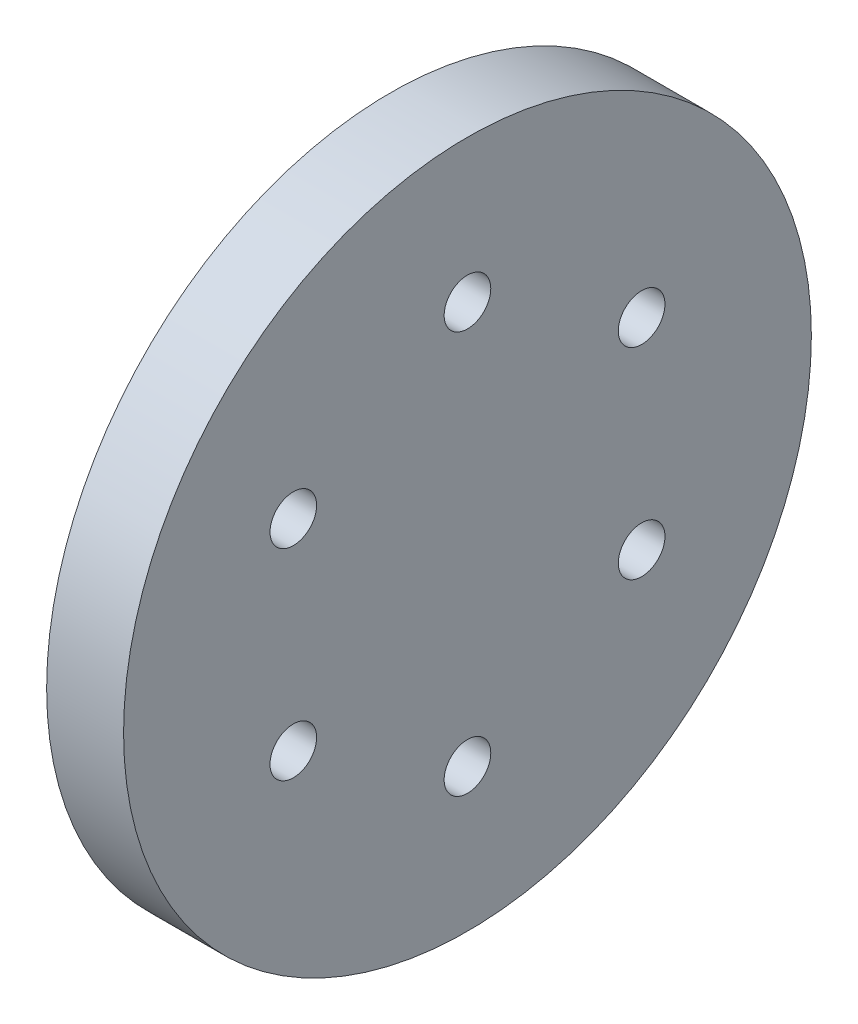
ISO-10303-21;
HEADER;
FILE_DESCRIPTION(('STEP AP214'),'2;1');
FILE_NAME('part.step','',(''),(''),'','','');
FILE_SCHEMA(('AUTOMOTIVE_DESIGN { 1 0 10303 214 1 1 1 1 }'));
ENDSEC;
DATA;
#1=APPLICATION_CONTEXT('core data for automotive mechanical design processes');
#2=APPLICATION_PROTOCOL_DEFINITION('international standard','automotive_design',2000,#1);
#3=PRODUCT_CONTEXT('',#1,'mechanical');
#4=PRODUCT('Part','Part','',(#3));
#5=PRODUCT_RELATED_PRODUCT_CATEGORY('part','',(#4));
#6=PRODUCT_DEFINITION_FORMATION('','',#4);
#7=PRODUCT_DEFINITION_CONTEXT('part definition',#1,'design');
#8=PRODUCT_DEFINITION('design','',#6,#7);
#9=PRODUCT_DEFINITION_SHAPE('','',#8);
#10=(LENGTH_UNIT() NAMED_UNIT(*) SI_UNIT(.MILLI.,.METRE.));
#11=(NAMED_UNIT(*) PLANE_ANGLE_UNIT() SI_UNIT($,.RADIAN.));
#12=(NAMED_UNIT(*) SI_UNIT($,.STERADIAN.) SOLID_ANGLE_UNIT());
#13=UNCERTAINTY_MEASURE_WITH_UNIT(LENGTH_MEASURE(1.E-05),#10,'distance_accuracy_value','');
#14=(GEOMETRIC_REPRESENTATION_CONTEXT(3) GLOBAL_UNCERTAINTY_ASSIGNED_CONTEXT((#13)) GLOBAL_UNIT_ASSIGNED_CONTEXT((#10,
#11,#12)) REPRESENTATION_CONTEXT('',''));
#15=CARTESIAN_POINT('',(0.,0.,0.));
#16=DIRECTION('',(0.,0.,1.));
#17=DIRECTION('',(1.,0.,0.));
#18=AXIS2_PLACEMENT_3D('',#15,#16,#17);
#19=CARTESIAN_POINT('',(6.6,0.,0.));
#20=DIRECTION('',(-1.,0.,0.));
#21=DIRECTION('',(0.,0.,1.));
#22=AXIS2_PLACEMENT_3D('',#19,#20,#21);
#23=CYLINDRICAL_SURFACE('',#22,29.5);
#24=CARTESIAN_POINT('',(6.6,0.,0.));
#25=DIRECTION('',(1.,0.,0.));
#26=DIRECTION('',(0.,0.,-1.));
#27=AXIS2_PLACEMENT_3D('',#24,#25,#26);
#28=CIRCLE('',#27,29.5);
#29=CARTESIAN_POINT('',(6.6,0.,-29.5));
#30=VERTEX_POINT('',#29);
#31=EDGE_CURVE('E10',#30,#30,#28,.T.);
#32=ORIENTED_EDGE('',*,*,#31,.F.);
#33=EDGE_LOOP('',(#32));
#34=FACE_BOUND('',#33,.T.);
#35=CARTESIAN_POINT('',(0.,0.,0.));
#36=DIRECTION('',(1.,0.,0.));
#37=DIRECTION('',(0.,0.,-1.));
#38=AXIS2_PLACEMENT_3D('',#35,#36,#37);
#39=CIRCLE('',#38,29.5);
#40=CARTESIAN_POINT('',(0.,0.,-29.5));
#41=VERTEX_POINT('',#40);
#42=EDGE_CURVE('E42',#41,#41,#39,.T.);
#43=ORIENTED_EDGE('',*,*,#42,.T.);
#44=EDGE_LOOP('',(#43));
#45=FACE_BOUND('',#44,.T.);
#46=ADVANCED_FACE('F35',(#34,#45),#23,.T.);
#47=CARTESIAN_POINT('',(6.6,0.,0.));
#48=DIRECTION('',(1.,0.,0.));
#49=DIRECTION('',(0.,0.,-1.));
#50=AXIS2_PLACEMENT_3D('',#47,#48,#49);
#51=PLANE('',#50);
#52=CARTESIAN_POINT('',(6.6,17.25,0.));
#53=DIRECTION('',(1.,0.,0.));
#54=DIRECTION('',(0.,0.,-1.));
#55=AXIS2_PLACEMENT_3D('',#52,#53,#54);
#56=CIRCLE('',#55,2.);
#57=CARTESIAN_POINT('',(6.6,17.25,-2.));
#58=VERTEX_POINT('',#57);
#59=EDGE_CURVE('E56',#58,#58,#56,.T.);
#60=ORIENTED_EDGE('',*,*,#59,.F.);
#61=EDGE_LOOP('',(#60));
#62=FACE_BOUND('',#61,.T.);
#63=CARTESIAN_POINT('',(6.6,8.62500000000018,14.9389382152815));
#64=DIRECTION('',(1.,0.,0.));
#65=DIRECTION('',(0.,0.,-1.));
#66=AXIS2_PLACEMENT_3D('',#63,#64,#65);
#67=CIRCLE('',#66,2.);
#68=CARTESIAN_POINT('',(6.6,8.62500000000018,12.9389382152815));
#69=VERTEX_POINT('',#68);
#70=EDGE_CURVE('E133',#69,#69,#67,.T.);
#71=ORIENTED_EDGE('',*,*,#70,.F.);
#72=EDGE_LOOP('',(#71));
#73=FACE_BOUND('',#72,.T.);
#74=CARTESIAN_POINT('',(6.6,-8.62499999999986,14.9389382152816));
#75=DIRECTION('',(1.,0.,0.));
#76=DIRECTION('',(0.,0.,-1.));
#77=AXIS2_PLACEMENT_3D('',#74,#75,#76);
#78=CIRCLE('',#77,2.);
#79=CARTESIAN_POINT('',(6.6,-8.62499999999986,12.9389382152816));
#80=VERTEX_POINT('',#79);
#81=EDGE_CURVE('E49',#80,#80,#78,.T.);
#82=ORIENTED_EDGE('',*,*,#81,.F.);
#83=EDGE_LOOP('',(#82));
#84=FACE_BOUND('',#83,.T.);
#85=CARTESIAN_POINT('',(6.6,-17.25,1.20456106190088E-13));
#86=DIRECTION('',(1.,0.,0.));
#87=DIRECTION('',(0.,0.,-1.));
#88=AXIS2_PLACEMENT_3D('',#85,#86,#87);
#89=CIRCLE('',#88,2.);
#90=CARTESIAN_POINT('',(6.6,-17.25,-1.99999999999988));
#91=VERTEX_POINT('',#90);
#92=EDGE_CURVE('E127',#91,#91,#89,.T.);
#93=ORIENTED_EDGE('',*,*,#92,.F.);
#94=EDGE_LOOP('',(#93));
#95=FACE_BOUND('',#94,.T.);
#96=CARTESIAN_POINT('',(6.6,-8.62500000000007,-14.9389382152815));
#97=DIRECTION('',(1.,0.,0.));
#98=DIRECTION('',(0.,0.,-1.));
#99=AXIS2_PLACEMENT_3D('',#96,#97,#98);
#100=CIRCLE('',#99,2.);
#101=CARTESIAN_POINT('',(6.6,-8.62500000000007,-16.9389382152815));
#102=VERTEX_POINT('',#101);
#103=EDGE_CURVE('E119',#102,#102,#100,.T.);
#104=ORIENTED_EDGE('',*,*,#103,.F.);
#105=EDGE_LOOP('',(#104));
#106=FACE_BOUND('',#105,.T.);
#107=CARTESIAN_POINT('',(6.6,8.62499999999997,-14.9389382152816));
#108=DIRECTION('',(1.,0.,0.));
#109=DIRECTION('',(0.,0.,-1.));
#110=AXIS2_PLACEMENT_3D('',#107,#108,#109);
#111=CIRCLE('',#110,2.);
#112=CARTESIAN_POINT('',(6.6,8.62499999999997,-16.9389382152816));
#113=VERTEX_POINT('',#112);
#114=EDGE_CURVE('E126',#113,#113,#111,.T.);
#115=ORIENTED_EDGE('',*,*,#114,.F.);
#116=EDGE_LOOP('',(#115));
#117=FACE_BOUND('',#116,.T.);
#118=ORIENTED_EDGE('',*,*,#31,.T.);
#119=EDGE_LOOP('',(#118));
#120=FACE_BOUND('',#119,.T.);
#121=ADVANCED_FACE('F86',(#62,#73,#84,#95,#106,#117,#120),#51,.T.);
#122=CARTESIAN_POINT('',(0.,0.,0.));
#123=DIRECTION('',(1.,0.,0.));
#124=DIRECTION('',(0.,0.,-1.));
#125=AXIS2_PLACEMENT_3D('',#122,#123,#124);
#126=PLANE('',#125);
#127=CARTESIAN_POINT('',(0.,17.25,0.));
#128=DIRECTION('',(1.,0.,0.));
#129=DIRECTION('',(0.,0.,-1.));
#130=AXIS2_PLACEMENT_3D('',#127,#128,#129);
#131=CIRCLE('',#130,2.);
#132=CARTESIAN_POINT('',(0.,17.25,-2.));
#133=VERTEX_POINT('',#132);
#134=EDGE_CURVE('E38',#133,#133,#131,.T.);
#135=ORIENTED_EDGE('',*,*,#134,.T.);
#136=EDGE_LOOP('',(#135));
#137=FACE_BOUND('',#136,.T.);
#138=CARTESIAN_POINT('',(0.,8.62500000000018,14.9389382152815));
#139=DIRECTION('',(1.,0.,0.));
#140=DIRECTION('',(0.,0.,-1.));
#141=AXIS2_PLACEMENT_3D('',#138,#139,#140);
#142=CIRCLE('',#141,2.);
#143=CARTESIAN_POINT('',(0.,8.62500000000018,12.9389382152815));
#144=VERTEX_POINT('',#143);
#145=EDGE_CURVE('E64',#144,#144,#142,.T.);
#146=ORIENTED_EDGE('',*,*,#145,.T.);
#147=EDGE_LOOP('',(#146));
#148=FACE_BOUND('',#147,.T.);
#149=CARTESIAN_POINT('',(0.,-8.62499999999986,14.9389382152816));
#150=DIRECTION('',(1.,0.,0.));
#151=DIRECTION('',(0.,0.,-1.));
#152=AXIS2_PLACEMENT_3D('',#149,#150,#151);
#153=CIRCLE('',#152,2.);
#154=CARTESIAN_POINT('',(0.,-8.62499999999986,12.9389382152816));
#155=VERTEX_POINT('',#154);
#156=EDGE_CURVE('E62',#155,#155,#153,.T.);
#157=ORIENTED_EDGE('',*,*,#156,.T.);
#158=EDGE_LOOP('',(#157));
#159=FACE_BOUND('',#158,.T.);
#160=CARTESIAN_POINT('',(0.,-17.25,1.20456106190088E-13));
#161=DIRECTION('',(1.,0.,0.));
#162=DIRECTION('',(0.,0.,-1.));
#163=AXIS2_PLACEMENT_3D('',#160,#161,#162);
#164=CIRCLE('',#163,2.);
#165=CARTESIAN_POINT('',(0.,-17.25,-1.99999999999988));
#166=VERTEX_POINT('',#165);
#167=EDGE_CURVE('E59',#166,#166,#164,.T.);
#168=ORIENTED_EDGE('',*,*,#167,.T.);
#169=EDGE_LOOP('',(#168));
#170=FACE_BOUND('',#169,.T.);
#171=CARTESIAN_POINT('',(0.,-8.62500000000007,-14.9389382152815));
#172=DIRECTION('',(1.,0.,0.));
#173=DIRECTION('',(0.,0.,-1.));
#174=AXIS2_PLACEMENT_3D('',#171,#172,#173);
#175=CIRCLE('',#174,2.);
#176=CARTESIAN_POINT('',(0.,-8.62500000000007,-16.9389382152815));
#177=VERTEX_POINT('',#176);
#178=EDGE_CURVE('E55',#177,#177,#175,.T.);
#179=ORIENTED_EDGE('',*,*,#178,.T.);
#180=EDGE_LOOP('',(#179));
#181=FACE_BOUND('',#180,.T.);
#182=CARTESIAN_POINT('',(0.,8.62499999999997,-14.9389382152816));
#183=DIRECTION('',(1.,0.,0.));
#184=DIRECTION('',(0.,0.,-1.));
#185=AXIS2_PLACEMENT_3D('',#182,#183,#184);
#186=CIRCLE('',#185,2.);
#187=CARTESIAN_POINT('',(0.,8.62499999999997,-16.9389382152816));
#188=VERTEX_POINT('',#187);
#189=EDGE_CURVE('E52',#188,#188,#186,.T.);
#190=ORIENTED_EDGE('',*,*,#189,.T.);
#191=EDGE_LOOP('',(#190));
#192=FACE_BOUND('',#191,.T.);
#193=ORIENTED_EDGE('',*,*,#42,.F.);
#194=EDGE_LOOP('',(#193));
#195=FACE_BOUND('',#194,.T.);
#196=ADVANCED_FACE('F71',(#137,#148,#159,#170,#181,#192,#195),#126,.F.);
#197=CARTESIAN_POINT('',(-14.4,8.62499999999997,-14.9389382152816));
#198=DIRECTION('',(1.,0.,0.));
#199=DIRECTION('',(0.,0.,-1.));
#200=AXIS2_PLACEMENT_3D('',#197,#198,#199);
#201=CYLINDRICAL_SURFACE('',#200,2.);
#202=ORIENTED_EDGE('',*,*,#114,.T.);
#203=EDGE_LOOP('',(#202));
#204=FACE_BOUND('',#203,.T.);
#205=ORIENTED_EDGE('',*,*,#189,.F.);
#206=EDGE_LOOP('',(#205));
#207=FACE_BOUND('',#206,.T.);
#208=ADVANCED_FACE('F97',(#204,#207),#201,.F.);
#209=CARTESIAN_POINT('',(-14.4,-8.62500000000007,-14.9389382152815));
#210=DIRECTION('',(1.,0.,0.));
#211=DIRECTION('',(0.,0.,-1.));
#212=AXIS2_PLACEMENT_3D('',#209,#210,#211);
#213=CYLINDRICAL_SURFACE('',#212,2.);
#214=ORIENTED_EDGE('',*,*,#103,.T.);
#215=EDGE_LOOP('',(#214));
#216=FACE_BOUND('',#215,.T.);
#217=ORIENTED_EDGE('',*,*,#178,.F.);
#218=EDGE_LOOP('',(#217));
#219=FACE_BOUND('',#218,.T.);
#220=ADVANCED_FACE('F101',(#216,#219),#213,.F.);
#221=CARTESIAN_POINT('',(-14.4,-17.25,1.20456106190088E-13));
#222=DIRECTION('',(1.,0.,0.));
#223=DIRECTION('',(0.,0.,-1.));
#224=AXIS2_PLACEMENT_3D('',#221,#222,#223);
#225=CYLINDRICAL_SURFACE('',#224,2.);
#226=ORIENTED_EDGE('',*,*,#92,.T.);
#227=EDGE_LOOP('',(#226));
#228=FACE_BOUND('',#227,.T.);
#229=ORIENTED_EDGE('',*,*,#167,.F.);
#230=EDGE_LOOP('',(#229));
#231=FACE_BOUND('',#230,.T.);
#232=ADVANCED_FACE('F107',(#228,#231),#225,.F.);
#233=CARTESIAN_POINT('',(-14.4,-8.62499999999986,14.9389382152816));
#234=DIRECTION('',(1.,0.,0.));
#235=DIRECTION('',(0.,0.,-1.));
#236=AXIS2_PLACEMENT_3D('',#233,#234,#235);
#237=CYLINDRICAL_SURFACE('',#236,2.);
#238=ORIENTED_EDGE('',*,*,#81,.T.);
#239=EDGE_LOOP('',(#238));
#240=FACE_BOUND('',#239,.T.);
#241=ORIENTED_EDGE('',*,*,#156,.F.);
#242=EDGE_LOOP('',(#241));
#243=FACE_BOUND('',#242,.T.);
#244=ADVANCED_FACE('F81',(#240,#243),#237,.F.);
#245=CARTESIAN_POINT('',(-14.4,8.62500000000018,14.9389382152815));
#246=DIRECTION('',(1.,0.,0.));
#247=DIRECTION('',(0.,0.,-1.));
#248=AXIS2_PLACEMENT_3D('',#245,#246,#247);
#249=CYLINDRICAL_SURFACE('',#248,2.);
#250=ORIENTED_EDGE('',*,*,#70,.T.);
#251=EDGE_LOOP('',(#250));
#252=FACE_BOUND('',#251,.T.);
#253=ORIENTED_EDGE('',*,*,#145,.F.);
#254=EDGE_LOOP('',(#253));
#255=FACE_BOUND('',#254,.T.);
#256=ADVANCED_FACE('F75',(#252,#255),#249,.F.);
#257=CARTESIAN_POINT('',(-14.4,17.25,0.));
#258=DIRECTION('',(1.,0.,0.));
#259=DIRECTION('',(0.,0.,-1.));
#260=AXIS2_PLACEMENT_3D('',#257,#258,#259);
#261=CYLINDRICAL_SURFACE('',#260,2.);
#262=ORIENTED_EDGE('',*,*,#59,.T.);
#263=EDGE_LOOP('',(#262));
#264=FACE_BOUND('',#263,.T.);
#265=ORIENTED_EDGE('',*,*,#134,.F.);
#266=EDGE_LOOP('',(#265));
#267=FACE_BOUND('',#266,.T.);
#268=ADVANCED_FACE('F73',(#264,#267),#261,.F.);
#269=CLOSED_SHELL('',(#46,#121,#196,#208,#220,#232,#244,#256,#268));
#270=MANIFOLD_SOLID_BREP('B2',#269);
#271=ADVANCED_BREP_SHAPE_REPRESENTATION('',(#18,#270),#14);
#272=SHAPE_DEFINITION_REPRESENTATION(#9,#271);
ENDSEC;
END-ISO-10303-21;
